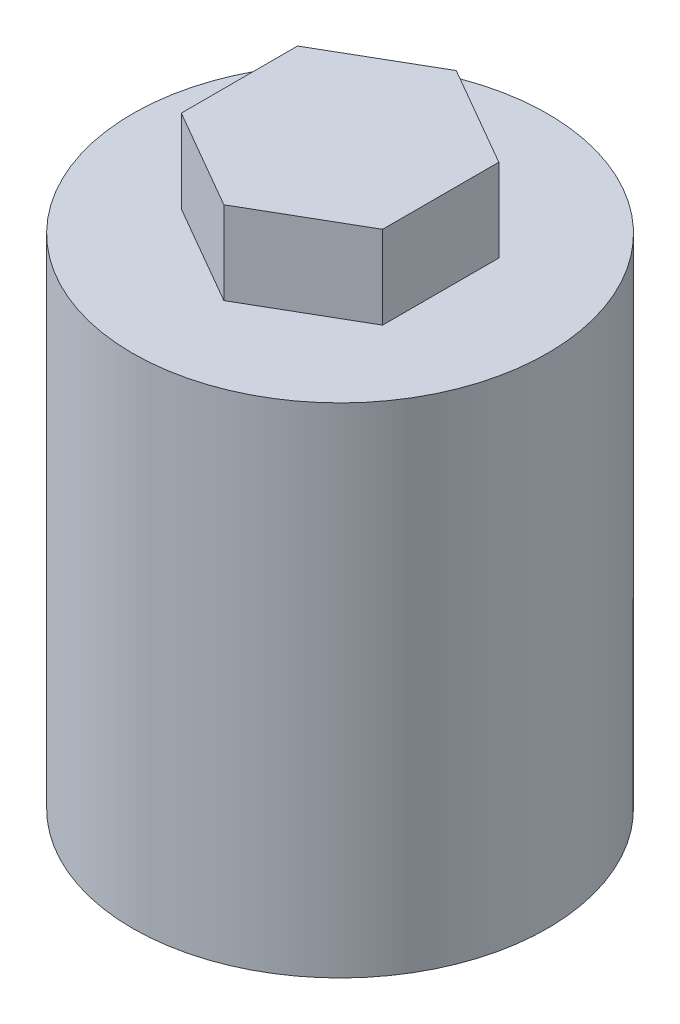
ISO-10303-21;
HEADER;
FILE_DESCRIPTION(('STEP AP214'),'2;1');
FILE_NAME('part.step','',(''),(''),'','','');
FILE_SCHEMA(('AUTOMOTIVE_DESIGN { 1 0 10303 214 1 1 1 1 }'));
ENDSEC;
DATA;
#1=APPLICATION_CONTEXT('core data for automotive mechanical design processes');
#2=APPLICATION_PROTOCOL_DEFINITION('international standard','automotive_design',2000,#1);
#3=PRODUCT_CONTEXT('',#1,'mechanical');
#4=PRODUCT('Part','Part','',(#3));
#5=PRODUCT_RELATED_PRODUCT_CATEGORY('part','',(#4));
#6=PRODUCT_DEFINITION_FORMATION('','',#4);
#7=PRODUCT_DEFINITION_CONTEXT('part definition',#1,'design');
#8=PRODUCT_DEFINITION('design','',#6,#7);
#9=PRODUCT_DEFINITION_SHAPE('','',#8);
#10=(LENGTH_UNIT() NAMED_UNIT(*) SI_UNIT(.MILLI.,.METRE.));
#11=(NAMED_UNIT(*) PLANE_ANGLE_UNIT() SI_UNIT($,.RADIAN.));
#12=(NAMED_UNIT(*) SI_UNIT($,.STERADIAN.) SOLID_ANGLE_UNIT());
#13=UNCERTAINTY_MEASURE_WITH_UNIT(LENGTH_MEASURE(1.E-05),#10,'distance_accuracy_value','');
#14=(GEOMETRIC_REPRESENTATION_CONTEXT(3) GLOBAL_UNCERTAINTY_ASSIGNED_CONTEXT((#13)) GLOBAL_UNIT_ASSIGNED_CONTEXT((#10,
#11,#12)) REPRESENTATION_CONTEXT('',''));
#15=CARTESIAN_POINT('',(0.,0.,0.));
#16=DIRECTION('',(0.,0.,1.));
#17=DIRECTION('',(1.,0.,0.));
#18=AXIS2_PLACEMENT_3D('',#15,#16,#17);
#19=CARTESIAN_POINT('',(0.,60.,0.));
#20=DIRECTION('',(0.,-1.,0.));
#21=DIRECTION('',(0.,0.,-1.));
#22=AXIS2_PLACEMENT_3D('',#19,#20,#21);
#23=CYLINDRICAL_SURFACE('',#22,25.);
#24=CARTESIAN_POINT('',(0.,60.,0.));
#25=DIRECTION('',(0.,1.,0.));
#26=DIRECTION('',(0.,0.,1.));
#27=AXIS2_PLACEMENT_3D('',#24,#25,#26);
#28=CIRCLE('',#27,25.);
#29=CARTESIAN_POINT('',(0.,60.,25.));
#30=VERTEX_POINT('',#29);
#31=EDGE_CURVE('E11',#30,#30,#28,.T.);
#32=ORIENTED_EDGE('',*,*,#31,.F.);
#33=EDGE_LOOP('',(#32));
#34=FACE_BOUND('',#33,.T.);
#35=CARTESIAN_POINT('',(0.,0.,0.));
#36=DIRECTION('',(0.,1.,0.));
#37=DIRECTION('',(0.,0.,1.));
#38=AXIS2_PLACEMENT_3D('',#35,#36,#37);
#39=CIRCLE('',#38,25.);
#40=CARTESIAN_POINT('',(0.,0.,25.));
#41=VERTEX_POINT('',#40);
#42=EDGE_CURVE('E42',#41,#41,#39,.T.);
#43=ORIENTED_EDGE('',*,*,#42,.T.);
#44=EDGE_LOOP('',(#43));
#45=FACE_BOUND('',#44,.T.);
#46=ADVANCED_FACE('F39',(#34,#45),#23,.T.);
#47=CARTESIAN_POINT('',(0.,60.,0.));
#48=DIRECTION('',(0.,1.,0.));
#49=DIRECTION('',(0.,0.,1.));
#50=AXIS2_PLACEMENT_3D('',#47,#48,#49);
#51=PLANE('',#50);
#52=DIRECTION('',(-0.866025403784439,0.,-0.5));
#53=VECTOR('',#52,1.);
#54=CARTESIAN_POINT('',(12.1243556529821,60.,-7.00000000000001));
#55=LINE('',#54,#53);
#56=CARTESIAN_POINT('',(12.1243556529821,60.,-7.00000000000001));
#57=VERTEX_POINT('',#56);
#58=CARTESIAN_POINT('',(0.,60.,-14.));
#59=VERTEX_POINT('',#58);
#60=EDGE_CURVE('E53',#57,#59,#55,.T.);
#61=ORIENTED_EDGE('',*,*,#60,.F.);
#62=DIRECTION('',(0.,0.,-1.));
#63=VECTOR('',#62,1.);
#64=CARTESIAN_POINT('',(12.1243556529821,60.,7.));
#65=LINE('',#64,#63);
#66=CARTESIAN_POINT('',(12.1243556529821,60.,7.));
#67=VERTEX_POINT('',#66);
#68=EDGE_CURVE('E57',#67,#57,#65,.T.);
#69=ORIENTED_EDGE('',*,*,#68,.F.);
#70=DIRECTION('',(0.866025403784439,0.,-0.5));
#71=VECTOR('',#70,1.);
#72=CARTESIAN_POINT('',(0.,60.,14.));
#73=LINE('',#72,#71);
#74=CARTESIAN_POINT('',(0.,60.,14.));
#75=VERTEX_POINT('',#74);
#76=EDGE_CURVE('E127',#75,#67,#73,.T.);
#77=ORIENTED_EDGE('',*,*,#76,.F.);
#78=DIRECTION('',(0.866025403784439,0.,0.5));
#79=VECTOR('',#78,1.);
#80=CARTESIAN_POINT('',(-12.1243556529821,60.,7.));
#81=LINE('',#80,#79);
#82=CARTESIAN_POINT('',(-12.1243556529821,60.,7.));
#83=VERTEX_POINT('',#82);
#84=EDGE_CURVE('E129',#83,#75,#81,.T.);
#85=ORIENTED_EDGE('',*,*,#84,.F.);
#86=DIRECTION('',(0.,0.,1.));
#87=VECTOR('',#86,1.);
#88=CARTESIAN_POINT('',(-12.1243556529821,60.,-7.00000000000001));
#89=LINE('',#88,#87);
#90=CARTESIAN_POINT('',(-12.1243556529821,60.,-7.00000000000001));
#91=VERTEX_POINT('',#90);
#92=EDGE_CURVE('E132',#91,#83,#89,.T.);
#93=ORIENTED_EDGE('',*,*,#92,.F.);
#94=DIRECTION('',(-0.866025403784439,0.,0.5));
#95=VECTOR('',#94,1.);
#96=CARTESIAN_POINT('',(0.,60.,-14.));
#97=LINE('',#96,#95);
#98=EDGE_CURVE('E135',#59,#91,#97,.T.);
#99=ORIENTED_EDGE('',*,*,#98,.F.);
#100=EDGE_LOOP('',(#61,#69,#77,#85,#93,#99));
#101=FACE_BOUND('',#100,.T.);
#102=ORIENTED_EDGE('',*,*,#31,.T.);
#103=EDGE_LOOP('',(#102));
#104=FACE_BOUND('',#103,.T.);
#105=ADVANCED_FACE('F165',(#101,#104),#51,.T.);
#106=CARTESIAN_POINT('',(0.,0.,0.));
#107=DIRECTION('',(0.,1.,0.));
#108=DIRECTION('',(0.,0.,1.));
#109=AXIS2_PLACEMENT_3D('',#106,#107,#108);
#110=PLANE('',#109);
#111=ORIENTED_EDGE('',*,*,#42,.F.);
#112=EDGE_LOOP('',(#111));
#113=FACE_BOUND('',#112,.T.);
#114=ADVANCED_FACE('F171',(#113),#110,.F.);
#115=CARTESIAN_POINT('',(12.1243556529821,70.,-7.00000000000001));
#116=DIRECTION('',(-0.5,0.,0.866025403784439));
#117=DIRECTION('',(0.866025403784439,0.,0.5));
#118=AXIS2_PLACEMENT_3D('',#115,#116,#117);
#119=PLANE('',#118);
#120=ORIENTED_EDGE('',*,*,#60,.T.);
#121=DIRECTION('',(0.,-1.,0.));
#122=VECTOR('',#121,1.);
#123=CARTESIAN_POINT('',(0.,70.,-14.));
#124=LINE('',#123,#122);
#125=CARTESIAN_POINT('',(0.,70.,-14.));
#126=VERTEX_POINT('',#125);
#127=EDGE_CURVE('E94',#126,#59,#124,.T.);
#128=ORIENTED_EDGE('',*,*,#127,.F.);
#129=DIRECTION('',(-0.866025403784439,0.,-0.5));
#130=VECTOR('',#129,1.);
#131=CARTESIAN_POINT('',(12.1243556529821,70.,-7.00000000000001));
#132=LINE('',#131,#130);
#133=CARTESIAN_POINT('',(12.1243556529821,70.,-7.00000000000001));
#134=VERTEX_POINT('',#133);
#135=EDGE_CURVE('E100',#134,#126,#132,.T.);
#136=ORIENTED_EDGE('',*,*,#135,.F.);
#137=DIRECTION('',(0.,-1.,0.));
#138=VECTOR('',#137,1.);
#139=CARTESIAN_POINT('',(12.1243556529821,70.,-7.00000000000001));
#140=LINE('',#139,#138);
#141=EDGE_CURVE('E124',#134,#57,#140,.T.);
#142=ORIENTED_EDGE('',*,*,#141,.T.);
#143=EDGE_LOOP('',(#120,#128,#136,#142));
#144=FACE_BOUND('',#143,.T.);
#145=ADVANCED_FACE('F110',(#144),#119,.F.);
#146=CARTESIAN_POINT('',(0.,70.,-14.));
#147=DIRECTION('',(0.5,0.,0.866025403784439));
#148=DIRECTION('',(0.866025403784439,0.,-0.5));
#149=AXIS2_PLACEMENT_3D('',#146,#147,#148);
#150=PLANE('',#149);
#151=ORIENTED_EDGE('',*,*,#98,.T.);
#152=DIRECTION('',(0.,-1.,0.));
#153=VECTOR('',#152,1.);
#154=CARTESIAN_POINT('',(-12.1243556529821,70.,-7.00000000000001));
#155=LINE('',#154,#153);
#156=CARTESIAN_POINT('',(-12.1243556529821,70.,-7.00000000000001));
#157=VERTEX_POINT('',#156);
#158=EDGE_CURVE('E96',#157,#91,#155,.T.);
#159=ORIENTED_EDGE('',*,*,#158,.F.);
#160=DIRECTION('',(-0.866025403784439,0.,0.5));
#161=VECTOR('',#160,1.);
#162=CARTESIAN_POINT('',(0.,70.,-14.));
#163=LINE('',#162,#161);
#164=EDGE_CURVE('E89',#126,#157,#163,.T.);
#165=ORIENTED_EDGE('',*,*,#164,.F.);
#166=ORIENTED_EDGE('',*,*,#127,.T.);
#167=EDGE_LOOP('',(#151,#159,#165,#166));
#168=FACE_BOUND('',#167,.T.);
#169=ADVANCED_FACE('F92',(#168),#150,.F.);
#170=CARTESIAN_POINT('',(-12.1243556529821,70.,-7.00000000000001));
#171=DIRECTION('',(1.,0.,0.));
#172=DIRECTION('',(0.,0.,-1.));
#173=AXIS2_PLACEMENT_3D('',#170,#171,#172);
#174=PLANE('',#173);
#175=ORIENTED_EDGE('',*,*,#92,.T.);
#176=DIRECTION('',(0.,-1.,0.));
#177=VECTOR('',#176,1.);
#178=CARTESIAN_POINT('',(-12.1243556529821,70.,7.));
#179=LINE('',#178,#177);
#180=CARTESIAN_POINT('',(-12.1243556529821,70.,7.));
#181=VERTEX_POINT('',#180);
#182=EDGE_CURVE('E113',#181,#83,#179,.T.);
#183=ORIENTED_EDGE('',*,*,#182,.F.);
#184=DIRECTION('',(0.,0.,1.));
#185=VECTOR('',#184,1.);
#186=CARTESIAN_POINT('',(-12.1243556529821,70.,-7.00000000000001));
#187=LINE('',#186,#185);
#188=EDGE_CURVE('E99',#157,#181,#187,.T.);
#189=ORIENTED_EDGE('',*,*,#188,.F.);
#190=ORIENTED_EDGE('',*,*,#158,.T.);
#191=EDGE_LOOP('',(#175,#183,#189,#190));
#192=FACE_BOUND('',#191,.T.);
#193=ADVANCED_FACE('F147',(#192),#174,.F.);
#194=CARTESIAN_POINT('',(-12.1243556529821,70.,7.));
#195=DIRECTION('',(0.5,0.,-0.866025403784439));
#196=DIRECTION('',(-0.866025403784439,0.,-0.5));
#197=AXIS2_PLACEMENT_3D('',#194,#195,#196);
#198=PLANE('',#197);
#199=ORIENTED_EDGE('',*,*,#84,.T.);
#200=DIRECTION('',(0.,-1.,0.));
#201=VECTOR('',#200,1.);
#202=CARTESIAN_POINT('',(0.,70.,14.));
#203=LINE('',#202,#201);
#204=CARTESIAN_POINT('',(0.,70.,14.));
#205=VERTEX_POINT('',#204);
#206=EDGE_CURVE('E118',#205,#75,#203,.T.);
#207=ORIENTED_EDGE('',*,*,#206,.F.);
#208=DIRECTION('',(0.866025403784439,0.,0.5));
#209=VECTOR('',#208,1.);
#210=CARTESIAN_POINT('',(-12.1243556529821,70.,7.));
#211=LINE('',#210,#209);
#212=EDGE_CURVE('E141',#181,#205,#211,.T.);
#213=ORIENTED_EDGE('',*,*,#212,.F.);
#214=ORIENTED_EDGE('',*,*,#182,.T.);
#215=EDGE_LOOP('',(#199,#207,#213,#214));
#216=FACE_BOUND('',#215,.T.);
#217=ADVANCED_FACE('F149',(#216),#198,.F.);
#218=CARTESIAN_POINT('',(0.,70.,14.));
#219=DIRECTION('',(-0.5,0.,-0.866025403784439));
#220=DIRECTION('',(-0.866025403784439,0.,0.5));
#221=AXIS2_PLACEMENT_3D('',#218,#219,#220);
#222=PLANE('',#221);
#223=ORIENTED_EDGE('',*,*,#76,.T.);
#224=DIRECTION('',(0.,-1.,0.));
#225=VECTOR('',#224,1.);
#226=CARTESIAN_POINT('',(12.1243556529821,70.,7.));
#227=LINE('',#226,#225);
#228=CARTESIAN_POINT('',(12.1243556529821,70.,7.));
#229=VERTEX_POINT('',#228);
#230=EDGE_CURVE('E121',#229,#67,#227,.T.);
#231=ORIENTED_EDGE('',*,*,#230,.F.);
#232=DIRECTION('',(0.866025403784439,0.,-0.5));
#233=VECTOR('',#232,1.);
#234=CARTESIAN_POINT('',(0.,70.,14.));
#235=LINE('',#234,#233);
#236=EDGE_CURVE('E139',#205,#229,#235,.T.);
#237=ORIENTED_EDGE('',*,*,#236,.F.);
#238=ORIENTED_EDGE('',*,*,#206,.T.);
#239=EDGE_LOOP('',(#223,#231,#237,#238));
#240=FACE_BOUND('',#239,.T.);
#241=ADVANCED_FACE('F153',(#240),#222,.F.);
#242=CARTESIAN_POINT('',(12.1243556529821,70.,7.));
#243=DIRECTION('',(-1.,0.,0.));
#244=DIRECTION('',(0.,0.,1.));
#245=AXIS2_PLACEMENT_3D('',#242,#243,#244);
#246=PLANE('',#245);
#247=ORIENTED_EDGE('',*,*,#68,.T.);
#248=ORIENTED_EDGE('',*,*,#141,.F.);
#249=DIRECTION('',(0.,0.,-1.));
#250=VECTOR('',#249,1.);
#251=CARTESIAN_POINT('',(12.1243556529821,70.,7.));
#252=LINE('',#251,#250);
#253=EDGE_CURVE('E105',#229,#134,#252,.T.);
#254=ORIENTED_EDGE('',*,*,#253,.F.);
#255=ORIENTED_EDGE('',*,*,#230,.T.);
#256=EDGE_LOOP('',(#247,#248,#254,#255));
#257=FACE_BOUND('',#256,.T.);
#258=ADVANCED_FACE('F155',(#257),#246,.F.);
#259=CARTESIAN_POINT('',(0.,70.,0.));
#260=DIRECTION('',(0.,1.,0.));
#261=DIRECTION('',(0.,0.,1.));
#262=AXIS2_PLACEMENT_3D('',#259,#260,#261);
#263=PLANE('',#262);
#264=ORIENTED_EDGE('',*,*,#135,.T.);
#265=ORIENTED_EDGE('',*,*,#164,.T.);
#266=ORIENTED_EDGE('',*,*,#188,.T.);
#267=ORIENTED_EDGE('',*,*,#212,.T.);
#268=ORIENTED_EDGE('',*,*,#236,.T.);
#269=ORIENTED_EDGE('',*,*,#253,.T.);
#270=EDGE_LOOP('',(#264,#265,#266,#267,#268,#269));
#271=FACE_BOUND('',#270,.T.);
#272=ADVANCED_FACE('F103',(#271),#263,.T.);
#273=CLOSED_SHELL('',(#46,#105,#114,#145,#169,#193,#217,#241,#258,#272));
#274=MANIFOLD_SOLID_BREP('B2',#273);
#275=ADVANCED_BREP_SHAPE_REPRESENTATION('',(#18,#274),#14);
#276=SHAPE_DEFINITION_REPRESENTATION(#9,#275);
ENDSEC;
END-ISO-10303-21;
